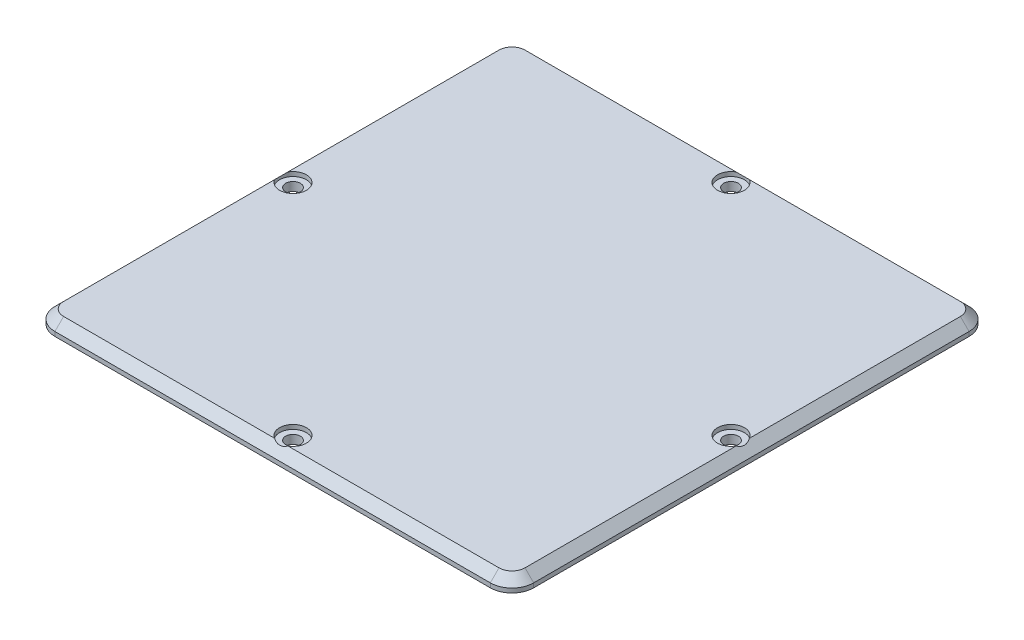
ISO-10303-21;
HEADER;
FILE_DESCRIPTION(('STEP AP214'),'2;1');
FILE_NAME('part.step','',(''),(''),'','','');
FILE_SCHEMA(('AUTOMOTIVE_DESIGN { 1 0 10303 214 1 1 1 1 }'));
ENDSEC;
DATA;
#1=APPLICATION_CONTEXT('core data for automotive mechanical design processes');
#2=APPLICATION_PROTOCOL_DEFINITION('international standard','automotive_design',2000,#1);
#3=PRODUCT_CONTEXT('',#1,'mechanical');
#4=PRODUCT('Part','Part','',(#3));
#5=PRODUCT_RELATED_PRODUCT_CATEGORY('part','',(#4));
#6=PRODUCT_DEFINITION_FORMATION('','',#4);
#7=PRODUCT_DEFINITION_CONTEXT('part definition',#1,'design');
#8=PRODUCT_DEFINITION('design','',#6,#7);
#9=PRODUCT_DEFINITION_SHAPE('','',#8);
#10=(LENGTH_UNIT() NAMED_UNIT(*) SI_UNIT(.MILLI.,.METRE.));
#11=(NAMED_UNIT(*) PLANE_ANGLE_UNIT() SI_UNIT($,.RADIAN.));
#12=(NAMED_UNIT(*) SI_UNIT($,.STERADIAN.) SOLID_ANGLE_UNIT());
#13=UNCERTAINTY_MEASURE_WITH_UNIT(LENGTH_MEASURE(1.E-05),#10,'distance_accuracy_value','');
#14=(GEOMETRIC_REPRESENTATION_CONTEXT(3) GLOBAL_UNCERTAINTY_ASSIGNED_CONTEXT((#13)) GLOBAL_UNIT_ASSIGNED_CONTEXT((#10,
#11,#12)) REPRESENTATION_CONTEXT('',''));
#15=CARTESIAN_POINT('',(0.,0.,0.));
#16=DIRECTION('',(0.,0.,1.));
#17=DIRECTION('',(1.,0.,0.));
#18=AXIS2_PLACEMENT_3D('',#15,#16,#17);
#19=CARTESIAN_POINT('',(36.75,-11.,-84.2641621588115));
#20=DIRECTION('',(0.,1.,0.));
#21=DIRECTION('',(0.,0.,1.));
#22=AXIS2_PLACEMENT_3D('',#19,#20,#21);
#23=CYLINDRICAL_SURFACE('',#22,5.);
#24=CARTESIAN_POINT('',(36.75,0.,-84.2641621588115));
#25=DIRECTION('',(0.,-1.,0.));
#26=DIRECTION('',(0.,0.,-1.));
#27=AXIS2_PLACEMENT_3D('',#24,#25,#26);
#28=CIRCLE('',#27,5.);
#29=CARTESIAN_POINT('',(36.75,0.,-89.2641621588116));
#30=VERTEX_POINT('',#29);
#31=EDGE_CURVE('E157',#30,#30,#28,.T.);
#32=ORIENTED_EDGE('',*,*,#31,.T.);
#33=EDGE_LOOP('',(#32));
#34=FACE_BOUND('',#33,.T.);
#35=CARTESIAN_POINT('',(36.75,-10.5652173913043,-84.2641621588115));
#36=DIRECTION('',(0.,-0.996240588195683,0.086629616364842));
#37=DIRECTION('',(0.,0.086629616364842,0.996240588195683));
#38=AXIS2_PLACEMENT_3D('',#35,#36,#37);
#39=ELLIPSE('',#38,5.01886799157182,5.);
#40=CARTESIAN_POINT('',(36.75,-10.1304347826087,-79.2641621588115));
#41=VERTEX_POINT('',#40);
#42=EDGE_CURVE('E394',#41,#41,#39,.T.);
#43=ORIENTED_EDGE('',*,*,#42,.F.);
#44=EDGE_LOOP('',(#43));
#45=FACE_BOUND('',#44,.T.);
#46=ADVANCED_FACE('F35',(#34,#45),#23,.T.);
#47=CARTESIAN_POINT('',(36.75,-11.,-36.7641621588116));
#48=DIRECTION('',(0.,1.,0.));
#49=DIRECTION('',(0.,0.,1.));
#50=AXIS2_PLACEMENT_3D('',#47,#48,#49);
#51=CYLINDRICAL_SURFACE('',#50,5.);
#52=CARTESIAN_POINT('',(36.75,0.,-36.7641621588116));
#53=DIRECTION('',(0.,-1.,0.));
#54=DIRECTION('',(0.,0.,-1.));
#55=AXIS2_PLACEMENT_3D('',#52,#53,#54);
#56=CIRCLE('',#55,5.);
#57=CARTESIAN_POINT('',(36.75,0.,-41.7641621588116));
#58=VERTEX_POINT('',#57);
#59=EDGE_CURVE('E385',#58,#58,#56,.T.);
#60=ORIENTED_EDGE('',*,*,#59,.T.);
#61=EDGE_LOOP('',(#60));
#62=FACE_BOUND('',#61,.T.);
#63=CARTESIAN_POINT('',(36.75,-6.43478260869565,-36.7641621588116));
#64=DIRECTION('',(0.,-0.996240588195683,0.086629616364842));
#65=DIRECTION('',(0.,0.086629616364842,0.996240588195683));
#66=AXIS2_PLACEMENT_3D('',#63,#64,#65);
#67=ELLIPSE('',#66,5.01886799157182,5.);
#68=CARTESIAN_POINT('',(36.75,-6.,-31.7641621588116));
#69=VERTEX_POINT('',#68);
#70=EDGE_CURVE('E397',#69,#69,#67,.T.);
#71=ORIENTED_EDGE('',*,*,#70,.F.);
#72=EDGE_LOOP('',(#71));
#73=FACE_BOUND('',#72,.T.);
#74=ADVANCED_FACE('F350',(#62,#73),#51,.T.);
#75=CARTESIAN_POINT('',(84.25,-11.,-36.7641621588116));
#76=DIRECTION('',(0.,1.,0.));
#77=DIRECTION('',(0.,0.,1.));
#78=AXIS2_PLACEMENT_3D('',#75,#76,#77);
#79=CYLINDRICAL_SURFACE('',#78,5.00000000000001);
#80=CARTESIAN_POINT('',(84.25,0.,-36.7641621588116));
#81=DIRECTION('',(0.,-1.,0.));
#82=DIRECTION('',(0.,0.,-1.));
#83=AXIS2_PLACEMENT_3D('',#80,#81,#82);
#84=CIRCLE('',#83,5.00000000000001);
#85=CARTESIAN_POINT('',(84.25,0.,-41.7641621588116));
#86=VERTEX_POINT('',#85);
#87=EDGE_CURVE('E388',#86,#86,#84,.T.);
#88=ORIENTED_EDGE('',*,*,#87,.T.);
#89=EDGE_LOOP('',(#88));
#90=FACE_BOUND('',#89,.T.);
#91=CARTESIAN_POINT('',(84.25,-6.43478260869565,-36.7641621588116));
#92=DIRECTION('',(0.,-0.996240588195683,0.086629616364842));
#93=DIRECTION('',(0.,0.086629616364842,0.996240588195683));
#94=AXIS2_PLACEMENT_3D('',#91,#92,#93);
#95=ELLIPSE('',#94,5.01886799157183,5.00000000000001);
#96=CARTESIAN_POINT('',(84.25,-6.,-31.7641621588115));
#97=VERTEX_POINT('',#96);
#98=EDGE_CURVE('E400',#97,#97,#95,.T.);
#99=ORIENTED_EDGE('',*,*,#98,.F.);
#100=EDGE_LOOP('',(#99));
#101=FACE_BOUND('',#100,.T.);
#102=ADVANCED_FACE('F356',(#90,#101),#79,.T.);
#103=CARTESIAN_POINT('',(84.25,-11.,-84.2641621588115));
#104=DIRECTION('',(0.,1.,0.));
#105=DIRECTION('',(0.,0.,1.));
#106=AXIS2_PLACEMENT_3D('',#103,#104,#105);
#107=CYLINDRICAL_SURFACE('',#106,5.00000000000001);
#108=CARTESIAN_POINT('',(84.25,0.,-84.2641621588115));
#109=DIRECTION('',(0.,-1.,0.));
#110=DIRECTION('',(0.,0.,-1.));
#111=AXIS2_PLACEMENT_3D('',#108,#109,#110);
#112=CIRCLE('',#111,5.00000000000001);
#113=CARTESIAN_POINT('',(84.25,0.,-89.2641621588116));
#114=VERTEX_POINT('',#113);
#115=EDGE_CURVE('E391',#114,#114,#112,.T.);
#116=ORIENTED_EDGE('',*,*,#115,.T.);
#117=EDGE_LOOP('',(#116));
#118=FACE_BOUND('',#117,.T.);
#119=CARTESIAN_POINT('',(84.25,-10.5652173913043,-84.2641621588115));
#120=DIRECTION('',(0.,-0.996240588195683,0.086629616364842));
#121=DIRECTION('',(0.,0.086629616364842,0.996240588195683));
#122=AXIS2_PLACEMENT_3D('',#119,#120,#121);
#123=ELLIPSE('',#122,5.01886799157183,5.00000000000001);
#124=CARTESIAN_POINT('',(84.25,-10.1304347826087,-79.2641621588115));
#125=VERTEX_POINT('',#124);
#126=EDGE_CURVE('E403',#125,#125,#123,.T.);
#127=ORIENTED_EDGE('',*,*,#126,.F.);
#128=EDGE_LOOP('',(#127));
#129=FACE_BOUND('',#128,.T.);
#130=ADVANCED_FACE('F462',(#118,#129),#107,.T.);
#131=CARTESIAN_POINT('',(10.3,3.,-115.7));
#132=DIRECTION('',(0.,0.,-1.));
#133=DIRECTION('',(-1.,0.,0.));
#134=AXIS2_PLACEMENT_3D('',#131,#132,#133);
#135=PLANE('',#134);
#136=DIRECTION('',(0.,-1.,0.));
#137=VECTOR('',#136,1.);
#138=CARTESIAN_POINT('',(10.3,3.,-115.7));
#139=LINE('',#138,#137);
#140=CARTESIAN_POINT('',(10.3,0.999999999999971,-115.7));
#141=VERTEX_POINT('',#140);
#142=CARTESIAN_POINT('',(10.3,0.,-115.7));
#143=VERTEX_POINT('',#142);
#144=EDGE_CURVE('E163',#141,#143,#139,.T.);
#145=ORIENTED_EDGE('',*,*,#144,.F.);
#146=DIRECTION('',(1.,0.,0.));
#147=VECTOR('',#146,1.);
#148=CARTESIAN_POINT('',(110.7,0.999999999999971,-115.7));
#149=LINE('',#148,#147);
#150=CARTESIAN_POINT('',(110.7,0.999999999999971,-115.7));
#151=VERTEX_POINT('',#150);
#152=EDGE_CURVE('E206',#141,#151,#149,.T.);
#153=ORIENTED_EDGE('',*,*,#152,.T.);
#154=DIRECTION('',(0.,-1.,0.));
#155=VECTOR('',#154,1.);
#156=CARTESIAN_POINT('',(110.7,3.,-115.7));
#157=LINE('',#156,#155);
#158=CARTESIAN_POINT('',(110.7,0.,-115.7));
#159=VERTEX_POINT('',#158);
#160=EDGE_CURVE('E170',#151,#159,#157,.T.);
#161=ORIENTED_EDGE('',*,*,#160,.T.);
#162=DIRECTION('',(1.,0.,0.));
#163=VECTOR('',#162,1.);
#164=CARTESIAN_POINT('',(10.3,0.,-115.7));
#165=LINE('',#164,#163);
#166=EDGE_CURVE('E231',#143,#159,#165,.T.);
#167=ORIENTED_EDGE('',*,*,#166,.F.);
#168=EDGE_LOOP('',(#145,#153,#161,#167));
#169=FACE_BOUND('',#168,.T.);
#170=ADVANCED_FACE('F310',(#169),#135,.T.);
#171=CARTESIAN_POINT('',(10.3,3.,-110.7));
#172=DIRECTION('',(0.,-1.,0.));
#173=DIRECTION('',(0.,0.,-1.));
#174=AXIS2_PLACEMENT_3D('',#171,#172,#173);
#175=CYLINDRICAL_SURFACE('',#174,5.);
#176=DIRECTION('',(0.,-1.,0.));
#177=VECTOR('',#176,1.);
#178=CARTESIAN_POINT('',(5.3,3.,-110.7));
#179=LINE('',#178,#177);
#180=CARTESIAN_POINT('',(5.3,0.999999999999971,-110.7));
#181=VERTEX_POINT('',#180);
#182=CARTESIAN_POINT('',(5.3,0.,-110.7));
#183=VERTEX_POINT('',#182);
#184=EDGE_CURVE('E166',#181,#183,#179,.T.);
#185=ORIENTED_EDGE('',*,*,#184,.F.);
#186=CARTESIAN_POINT('',(10.3,0.999999999999971,-110.7));
#187=DIRECTION('',(0.,-1.,0.));
#188=DIRECTION('',(0.,0.,-1.));
#189=AXIS2_PLACEMENT_3D('',#186,#187,#188);
#190=CIRCLE('',#189,5.);
#191=EDGE_CURVE('E202',#181,#141,#190,.T.);
#192=ORIENTED_EDGE('',*,*,#191,.T.);
#193=ORIENTED_EDGE('',*,*,#144,.T.);
#194=CARTESIAN_POINT('',(10.3,0.,-110.7));
#195=DIRECTION('',(0.,-1.,0.));
#196=DIRECTION('',(0.,0.,-1.));
#197=AXIS2_PLACEMENT_3D('',#194,#195,#196);
#198=CIRCLE('',#197,5.);
#199=EDGE_CURVE('E291',#183,#143,#198,.T.);
#200=ORIENTED_EDGE('',*,*,#199,.F.);
#201=EDGE_LOOP('',(#185,#192,#193,#200));
#202=FACE_BOUND('',#201,.T.);
#203=ADVANCED_FACE('F320',(#202),#175,.T.);
#204=CARTESIAN_POINT('',(5.3,3.,-10.3));
#205=DIRECTION('',(-1.,0.,0.));
#206=DIRECTION('',(0.,0.,1.));
#207=AXIS2_PLACEMENT_3D('',#204,#205,#206);
#208=PLANE('',#207);
#209=DIRECTION('',(0.,-1.,0.));
#210=VECTOR('',#209,1.);
#211=CARTESIAN_POINT('',(5.3,3.,-10.3));
#212=LINE('',#211,#210);
#213=CARTESIAN_POINT('',(5.3,0.999999999999971,-10.3));
#214=VERTEX_POINT('',#213);
#215=CARTESIAN_POINT('',(5.3,0.,-10.3));
#216=VERTEX_POINT('',#215);
#217=EDGE_CURVE('E295',#214,#216,#212,.T.);
#218=ORIENTED_EDGE('',*,*,#217,.F.);
#219=DIRECTION('',(0.,0.,-1.));
#220=VECTOR('',#219,1.);
#221=CARTESIAN_POINT('',(5.3,0.999999999999971,-110.7));
#222=LINE('',#221,#220);
#223=EDGE_CURVE('E196',#214,#181,#222,.T.);
#224=ORIENTED_EDGE('',*,*,#223,.T.);
#225=ORIENTED_EDGE('',*,*,#184,.T.);
#226=DIRECTION('',(0.,0.,-1.));
#227=VECTOR('',#226,1.);
#228=CARTESIAN_POINT('',(5.3,0.,-10.3));
#229=LINE('',#228,#227);
#230=EDGE_CURVE('E288',#216,#183,#229,.T.);
#231=ORIENTED_EDGE('',*,*,#230,.F.);
#232=EDGE_LOOP('',(#218,#224,#225,#231));
#233=FACE_BOUND('',#232,.T.);
#234=ADVANCED_FACE('F518',(#233),#208,.T.);
#235=CARTESIAN_POINT('',(10.3,3.,-10.3));
#236=DIRECTION('',(0.,-1.,0.));
#237=DIRECTION('',(0.,0.,-1.));
#238=AXIS2_PLACEMENT_3D('',#235,#236,#237);
#239=CYLINDRICAL_SURFACE('',#238,5.);
#240=DIRECTION('',(0.,-1.,0.));
#241=VECTOR('',#240,1.);
#242=CARTESIAN_POINT('',(10.3,3.,-5.3));
#243=LINE('',#242,#241);
#244=CARTESIAN_POINT('',(10.3,0.999999999999971,-5.3));
#245=VERTEX_POINT('',#244);
#246=CARTESIAN_POINT('',(10.3,0.,-5.3));
#247=VERTEX_POINT('',#246);
#248=EDGE_CURVE('E297',#245,#247,#243,.T.);
#249=ORIENTED_EDGE('',*,*,#248,.F.);
#250=CARTESIAN_POINT('',(10.3,0.999999999999971,-10.3));
#251=DIRECTION('',(0.,-1.,0.));
#252=DIRECTION('',(0.,0.,-1.));
#253=AXIS2_PLACEMENT_3D('',#250,#251,#252);
#254=CIRCLE('',#253,5.);
#255=EDGE_CURVE('E198',#245,#214,#254,.T.);
#256=ORIENTED_EDGE('',*,*,#255,.T.);
#257=ORIENTED_EDGE('',*,*,#217,.T.);
#258=CARTESIAN_POINT('',(10.3,0.,-10.3));
#259=DIRECTION('',(0.,-1.,0.));
#260=DIRECTION('',(0.,0.,-1.));
#261=AXIS2_PLACEMENT_3D('',#258,#259,#260);
#262=CIRCLE('',#261,5.);
#263=EDGE_CURVE('E285',#247,#216,#262,.T.);
#264=ORIENTED_EDGE('',*,*,#263,.F.);
#265=EDGE_LOOP('',(#249,#256,#257,#264));
#266=FACE_BOUND('',#265,.T.);
#267=ADVANCED_FACE('F521',(#266),#239,.T.);
#268=CARTESIAN_POINT('',(10.3,3.,-5.3));
#269=DIRECTION('',(0.,0.,-1.));
#270=DIRECTION('',(-1.,0.,0.));
#271=AXIS2_PLACEMENT_3D('',#268,#269,#270);
#272=PLANE('',#271);
#273=DIRECTION('',(0.,-1.,0.));
#274=VECTOR('',#273,1.);
#275=CARTESIAN_POINT('',(110.7,3.,-5.3));
#276=LINE('',#275,#274);
#277=CARTESIAN_POINT('',(110.7,0.99999999999997,-5.3));
#278=VERTEX_POINT('',#277);
#279=CARTESIAN_POINT('',(110.7,0.,-5.3));
#280=VERTEX_POINT('',#279);
#281=EDGE_CURVE('E299',#278,#280,#276,.T.);
#282=ORIENTED_EDGE('',*,*,#281,.F.);
#283=DIRECTION('',(-1.,0.,0.));
#284=VECTOR('',#283,1.);
#285=CARTESIAN_POINT('',(10.3,0.999999999999957,-5.3));
#286=LINE('',#285,#284);
#287=EDGE_CURVE('E191',#278,#245,#286,.T.);
#288=ORIENTED_EDGE('',*,*,#287,.T.);
#289=ORIENTED_EDGE('',*,*,#248,.T.);
#290=DIRECTION('',(1.,0.,0.));
#291=VECTOR('',#290,1.);
#292=CARTESIAN_POINT('',(10.3,0.,-5.3));
#293=LINE('',#292,#291);
#294=EDGE_CURVE('E282',#247,#280,#293,.T.);
#295=ORIENTED_EDGE('',*,*,#294,.T.);
#296=EDGE_LOOP('',(#282,#288,#289,#295));
#297=FACE_BOUND('',#296,.T.);
#298=ADVANCED_FACE('F525',(#297),#272,.F.);
#299=CARTESIAN_POINT('',(110.7,3.,-10.3));
#300=DIRECTION('',(0.,-1.,0.));
#301=DIRECTION('',(0.,0.,-1.));
#302=AXIS2_PLACEMENT_3D('',#299,#300,#301);
#303=CYLINDRICAL_SURFACE('',#302,5.);
#304=DIRECTION('',(0.,-1.,0.));
#305=VECTOR('',#304,1.);
#306=CARTESIAN_POINT('',(115.7,3.,-10.3));
#307=LINE('',#306,#305);
#308=CARTESIAN_POINT('',(115.7,0.99999999999997,-10.3));
#309=VERTEX_POINT('',#308);
#310=CARTESIAN_POINT('',(115.7,0.,-10.3));
#311=VERTEX_POINT('',#310);
#312=EDGE_CURVE('E301',#309,#311,#307,.T.);
#313=ORIENTED_EDGE('',*,*,#312,.F.);
#314=CARTESIAN_POINT('',(110.7,0.99999999999997,-10.3));
#315=DIRECTION('',(0.,-1.,0.));
#316=DIRECTION('',(0.,0.,-1.));
#317=AXIS2_PLACEMENT_3D('',#314,#315,#316);
#318=CIRCLE('',#317,5.);
#319=EDGE_CURVE('E200',#309,#278,#318,.T.);
#320=ORIENTED_EDGE('',*,*,#319,.T.);
#321=ORIENTED_EDGE('',*,*,#281,.T.);
#322=CARTESIAN_POINT('',(110.7,0.,-10.3));
#323=DIRECTION('',(0.,1.,0.));
#324=DIRECTION('',(0.,0.,1.));
#325=AXIS2_PLACEMENT_3D('',#322,#323,#324);
#326=CIRCLE('',#325,5.);
#327=EDGE_CURVE('E279',#280,#311,#326,.T.);
#328=ORIENTED_EDGE('',*,*,#327,.T.);
#329=EDGE_LOOP('',(#313,#320,#321,#328));
#330=FACE_BOUND('',#329,.T.);
#331=ADVANCED_FACE('F529',(#330),#303,.T.);
#332=CARTESIAN_POINT('',(115.7,3.,-10.3));
#333=DIRECTION('',(-1.,0.,0.));
#334=DIRECTION('',(0.,0.,1.));
#335=AXIS2_PLACEMENT_3D('',#332,#333,#334);
#336=PLANE('',#335);
#337=DIRECTION('',(0.,-1.,0.));
#338=VECTOR('',#337,1.);
#339=CARTESIAN_POINT('',(115.7,3.,-110.7));
#340=LINE('',#339,#338);
#341=CARTESIAN_POINT('',(115.7,0.999999999999971,-110.7));
#342=VERTEX_POINT('',#341);
#343=CARTESIAN_POINT('',(115.7,0.,-110.7));
#344=VERTEX_POINT('',#343);
#345=EDGE_CURVE('E302',#342,#344,#340,.T.);
#346=ORIENTED_EDGE('',*,*,#345,.F.);
#347=DIRECTION('',(0.,0.,1.));
#348=VECTOR('',#347,1.);
#349=CARTESIAN_POINT('',(115.7,0.999999999999998,-10.3));
#350=LINE('',#349,#348);
#351=EDGE_CURVE('E194',#342,#309,#350,.T.);
#352=ORIENTED_EDGE('',*,*,#351,.T.);
#353=ORIENTED_EDGE('',*,*,#312,.T.);
#354=DIRECTION('',(0.,0.,-1.));
#355=VECTOR('',#354,1.);
#356=CARTESIAN_POINT('',(115.7,0.,-10.3));
#357=LINE('',#356,#355);
#358=EDGE_CURVE('E276',#311,#344,#357,.T.);
#359=ORIENTED_EDGE('',*,*,#358,.T.);
#360=EDGE_LOOP('',(#346,#352,#353,#359));
#361=FACE_BOUND('',#360,.T.);
#362=ADVANCED_FACE('F533',(#361),#336,.F.);
#363=CARTESIAN_POINT('',(110.7,3.,-110.7));
#364=DIRECTION('',(0.,-1.,0.));
#365=DIRECTION('',(0.,0.,-1.));
#366=AXIS2_PLACEMENT_3D('',#363,#364,#365);
#367=CYLINDRICAL_SURFACE('',#366,5.00000000000001);
#368=ORIENTED_EDGE('',*,*,#160,.F.);
#369=CARTESIAN_POINT('',(110.7,0.999999999999971,-110.7));
#370=DIRECTION('',(0.,-1.,0.));
#371=DIRECTION('',(0.,0.,-1.));
#372=AXIS2_PLACEMENT_3D('',#369,#370,#371);
#373=CIRCLE('',#372,5.00000000000001);
#374=EDGE_CURVE('E204',#151,#342,#373,.T.);
#375=ORIENTED_EDGE('',*,*,#374,.T.);
#376=ORIENTED_EDGE('',*,*,#345,.T.);
#377=CARTESIAN_POINT('',(110.7,0.,-110.7));
#378=DIRECTION('',(0.,-1.,0.));
#379=DIRECTION('',(0.,0.,-1.));
#380=AXIS2_PLACEMENT_3D('',#377,#378,#379);
#381=CIRCLE('',#380,5.00000000000001);
#382=EDGE_CURVE('E273',#159,#344,#381,.T.);
#383=ORIENTED_EDGE('',*,*,#382,.F.);
#384=EDGE_LOOP('',(#368,#375,#376,#383));
#385=FACE_BOUND('',#384,.T.);
#386=ADVANCED_FACE('F312',(#385),#367,.T.);
#387=CARTESIAN_POINT('',(110.7,3.,-110.7));
#388=DIRECTION('',(0.,-1.,0.));
#389=DIRECTION('',(0.,0.,-1.));
#390=AXIS2_PLACEMENT_3D('',#387,#388,#389);
#391=PLANE('',#390);
#392=DIRECTION('',(-1.,0.,0.));
#393=VECTOR('',#392,1.);
#394=CARTESIAN_POINT('',(10.3,3.,-113.7));
#395=LINE('',#394,#393);
#396=CARTESIAN_POINT('',(110.7,3.,-113.7));
#397=VERTEX_POINT('',#396);
#398=CARTESIAN_POINT('',(62.0231546211728,3.,-113.7));
#399=VERTEX_POINT('',#398);
#400=EDGE_CURVE('E155',#397,#399,#395,.T.);
#401=ORIENTED_EDGE('',*,*,#400,.T.);
#402=CARTESIAN_POINT('',(60.5,3.,-111.));
#403=DIRECTION('',(0.,1.,0.));
#404=DIRECTION('',(0.,0.,1.));
#405=AXIS2_PLACEMENT_3D('',#402,#403,#404);
#406=CIRCLE('',#405,3.1);
#407=CARTESIAN_POINT('',(58.9768453788271,3.,-113.7));
#408=VERTEX_POINT('',#407);
#409=EDGE_CURVE('E49',#408,#399,#406,.T.);
#410=ORIENTED_EDGE('',*,*,#409,.F.);
#411=CARTESIAN_POINT('',(10.3,3.,-113.7));
#412=VERTEX_POINT('',#411);
#413=EDGE_CURVE('E153',#408,#412,#395,.T.);
#414=ORIENTED_EDGE('',*,*,#413,.T.);
#415=CARTESIAN_POINT('',(10.3,3.,-110.7));
#416=DIRECTION('',(0.,-1.,0.));
#417=DIRECTION('',(0.,0.,-1.));
#418=AXIS2_PLACEMENT_3D('',#415,#416,#417);
#419=CIRCLE('',#418,2.99999999999996);
#420=CARTESIAN_POINT('',(7.30000000000004,3.,-110.7));
#421=VERTEX_POINT('',#420);
#422=EDGE_CURVE('E173',#412,#421,#419,.F.);
#423=ORIENTED_EDGE('',*,*,#422,.T.);
#424=DIRECTION('',(0.,0.,1.));
#425=VECTOR('',#424,1.);
#426=CARTESIAN_POINT('',(7.30000000000004,3.,-10.3));
#427=LINE('',#426,#425);
#428=CARTESIAN_POINT('',(7.30000000000004,3.,-62.0231546211729));
#429=VERTEX_POINT('',#428);
#430=EDGE_CURVE('E176',#421,#429,#427,.T.);
#431=ORIENTED_EDGE('',*,*,#430,.T.);
#432=CARTESIAN_POINT('',(9.99999999999999,3.,-60.5));
#433=DIRECTION('',(0.,1.,0.));
#434=DIRECTION('',(0.,0.,1.));
#435=AXIS2_PLACEMENT_3D('',#432,#433,#434);
#436=CIRCLE('',#435,3.1);
#437=CARTESIAN_POINT('',(7.30000000000004,3.,-58.9768453788271));
#438=VERTEX_POINT('',#437);
#439=EDGE_CURVE('E56',#438,#429,#436,.T.);
#440=ORIENTED_EDGE('',*,*,#439,.F.);
#441=CARTESIAN_POINT('',(7.30000000000004,3.,-10.3));
#442=VERTEX_POINT('',#441);
#443=EDGE_CURVE('E175',#438,#442,#427,.T.);
#444=ORIENTED_EDGE('',*,*,#443,.T.);
#445=CARTESIAN_POINT('',(10.3,3.,-10.3));
#446=DIRECTION('',(0.,-1.,0.));
#447=DIRECTION('',(0.,0.,-1.));
#448=AXIS2_PLACEMENT_3D('',#445,#446,#447);
#449=CIRCLE('',#448,2.99999999999996);
#450=CARTESIAN_POINT('',(10.3,3.,-7.30000000000004));
#451=VERTEX_POINT('',#450);
#452=EDGE_CURVE('E185',#442,#451,#449,.F.);
#453=ORIENTED_EDGE('',*,*,#452,.T.);
#454=DIRECTION('',(1.,0.,0.));
#455=VECTOR('',#454,1.);
#456=CARTESIAN_POINT('',(110.7,3.,-7.30000000000003));
#457=LINE('',#456,#455);
#458=CARTESIAN_POINT('',(58.9768453788272,3.,-7.30000000000003));
#459=VERTEX_POINT('',#458);
#460=EDGE_CURVE('E188',#451,#459,#457,.T.);
#461=ORIENTED_EDGE('',*,*,#460,.T.);
#462=CARTESIAN_POINT('',(60.5,3.,-10.));
#463=DIRECTION('',(0.,1.,0.));
#464=DIRECTION('',(0.,0.,1.));
#465=AXIS2_PLACEMENT_3D('',#462,#463,#464);
#466=CIRCLE('',#465,3.10000000000001);
#467=CARTESIAN_POINT('',(62.0231546211728,3.,-7.30000000000003));
#468=VERTEX_POINT('',#467);
#469=EDGE_CURVE('E246',#468,#459,#466,.T.);
#470=ORIENTED_EDGE('',*,*,#469,.F.);
#471=CARTESIAN_POINT('',(110.7,3.,-7.30000000000004));
#472=VERTEX_POINT('',#471);
#473=EDGE_CURVE('E187',#468,#472,#457,.T.);
#474=ORIENTED_EDGE('',*,*,#473,.T.);
#475=CARTESIAN_POINT('',(110.7,3.,-10.3));
#476=DIRECTION('',(0.,-1.,0.));
#477=DIRECTION('',(0.,0.,-1.));
#478=AXIS2_PLACEMENT_3D('',#475,#476,#477);
#479=CIRCLE('',#478,2.99999999999996);
#480=CARTESIAN_POINT('',(113.7,3.,-10.3));
#481=VERTEX_POINT('',#480);
#482=EDGE_CURVE('E183',#472,#481,#479,.F.);
#483=ORIENTED_EDGE('',*,*,#482,.T.);
#484=DIRECTION('',(0.,0.,-1.));
#485=VECTOR('',#484,1.);
#486=CARTESIAN_POINT('',(113.7,3.,-110.7));
#487=LINE('',#486,#485);
#488=CARTESIAN_POINT('',(113.7,3.,-58.9768453788272));
#489=VERTEX_POINT('',#488);
#490=EDGE_CURVE('E180',#481,#489,#487,.T.);
#491=ORIENTED_EDGE('',*,*,#490,.T.);
#492=CARTESIAN_POINT('',(111.,3.,-60.5));
#493=DIRECTION('',(0.,1.,0.));
#494=DIRECTION('',(0.,0.,1.));
#495=AXIS2_PLACEMENT_3D('',#492,#493,#494);
#496=CIRCLE('',#495,3.10000000000001);
#497=CARTESIAN_POINT('',(113.7,3.,-62.0231546211728));
#498=VERTEX_POINT('',#497);
#499=EDGE_CURVE('E241',#498,#489,#496,.T.);
#500=ORIENTED_EDGE('',*,*,#499,.F.);
#501=CARTESIAN_POINT('',(113.7,3.,-110.7));
#502=VERTEX_POINT('',#501);
#503=EDGE_CURVE('E179',#498,#502,#487,.T.);
#504=ORIENTED_EDGE('',*,*,#503,.T.);
#505=CARTESIAN_POINT('',(110.7,3.,-110.7));
#506=DIRECTION('',(0.,-1.,0.));
#507=DIRECTION('',(0.,0.,-1.));
#508=AXIS2_PLACEMENT_3D('',#505,#506,#507);
#509=CIRCLE('',#508,2.99999999999998);
#510=EDGE_CURVE('E165',#502,#397,#509,.F.);
#511=ORIENTED_EDGE('',*,*,#510,.T.);
#512=EDGE_LOOP('',(#401,#410,#414,#423,#431,#440,#444,#453,#461,#470,#474,#483,#491,#500,#504,#511));
#513=FACE_BOUND('',#512,.T.);
#514=ADVANCED_FACE('F152',(#513),#391,.F.);
#515=CARTESIAN_POINT('',(110.7,0.,-110.7));
#516=DIRECTION('',(0.,-1.,0.));
#517=DIRECTION('',(0.,0.,-1.));
#518=AXIS2_PLACEMENT_3D('',#515,#516,#517);
#519=PLANE('',#518);
#520=ORIENTED_EDGE('',*,*,#115,.F.);
#521=EDGE_LOOP('',(#520));
#522=FACE_BOUND('',#521,.T.);
#523=ORIENTED_EDGE('',*,*,#87,.F.);
#524=EDGE_LOOP('',(#523));
#525=FACE_BOUND('',#524,.T.);
#526=ORIENTED_EDGE('',*,*,#59,.F.);
#527=EDGE_LOOP('',(#526));
#528=FACE_BOUND('',#527,.T.);
#529=ORIENTED_EDGE('',*,*,#31,.F.);
#530=EDGE_LOOP('',(#529));
#531=FACE_BOUND('',#530,.T.);
#532=CARTESIAN_POINT('',(60.5,0.,-111.));
#533=DIRECTION('',(0.,-1.,0.));
#534=DIRECTION('',(0.,0.,-1.));
#535=AXIS2_PLACEMENT_3D('',#532,#533,#534);
#536=CIRCLE('',#535,1.7);
#537=CARTESIAN_POINT('',(60.5,0.,-112.7));
#538=VERTEX_POINT('',#537);
#539=EDGE_CURVE('E39',#538,#538,#536,.T.);
#540=ORIENTED_EDGE('',*,*,#539,.F.);
#541=EDGE_LOOP('',(#540));
#542=FACE_BOUND('',#541,.T.);
#543=CARTESIAN_POINT('',(9.99999999999999,0.,-60.5));
#544=DIRECTION('',(0.,-1.,0.));
#545=DIRECTION('',(0.,0.,-1.));
#546=AXIS2_PLACEMENT_3D('',#543,#544,#545);
#547=CIRCLE('',#546,1.7);
#548=CARTESIAN_POINT('',(9.99999999999999,0.,-62.2));
#549=VERTEX_POINT('',#548);
#550=EDGE_CURVE('E244',#549,#549,#547,.T.);
#551=ORIENTED_EDGE('',*,*,#550,.F.);
#552=EDGE_LOOP('',(#551));
#553=FACE_BOUND('',#552,.T.);
#554=CARTESIAN_POINT('',(60.5,0.,-10.));
#555=DIRECTION('',(0.,-1.,0.));
#556=DIRECTION('',(0.,0.,-1.));
#557=AXIS2_PLACEMENT_3D('',#554,#555,#556);
#558=CIRCLE('',#557,1.7);
#559=CARTESIAN_POINT('',(60.5,0.,-11.7));
#560=VERTEX_POINT('',#559);
#561=EDGE_CURVE('E238',#560,#560,#558,.T.);
#562=ORIENTED_EDGE('',*,*,#561,.F.);
#563=EDGE_LOOP('',(#562));
#564=FACE_BOUND('',#563,.T.);
#565=CARTESIAN_POINT('',(111.,0.,-60.5));
#566=DIRECTION('',(0.,-1.,0.));
#567=DIRECTION('',(0.,0.,-1.));
#568=AXIS2_PLACEMENT_3D('',#565,#566,#567);
#569=CIRCLE('',#568,1.69999999999999);
#570=CARTESIAN_POINT('',(111.,0.,-62.2));
#571=VERTEX_POINT('',#570);
#572=EDGE_CURVE('E213',#571,#571,#569,.T.);
#573=ORIENTED_EDGE('',*,*,#572,.F.);
#574=EDGE_LOOP('',(#573));
#575=FACE_BOUND('',#574,.T.);
#576=ORIENTED_EDGE('',*,*,#166,.T.);
#577=ORIENTED_EDGE('',*,*,#382,.T.);
#578=ORIENTED_EDGE('',*,*,#358,.F.);
#579=ORIENTED_EDGE('',*,*,#327,.F.);
#580=ORIENTED_EDGE('',*,*,#294,.F.);
#581=ORIENTED_EDGE('',*,*,#263,.T.);
#582=ORIENTED_EDGE('',*,*,#230,.T.);
#583=ORIENTED_EDGE('',*,*,#199,.T.);
#584=EDGE_LOOP('',(#576,#577,#578,#579,#580,#581,#582,#583));
#585=FACE_BOUND('',#584,.T.);
#586=ADVANCED_FACE('F315',(#522,#525,#528,#531,#542,#553,#564,#575,#585),#519,.T.);
#587=CARTESIAN_POINT('',(10.3,0.999999999999971,-115.7));
#588=DIRECTION('',(0.,0.70710678118655,-0.707106781186545));
#589=DIRECTION('',(-1.,0.,0.));
#590=AXIS2_PLACEMENT_3D('',#587,#588,#589);
#591=PLANE('',#590);
#592=CARTESIAN_POINT('',(60.5,5.69999999999993,-111.));
#593=DIRECTION('',(0.,0.70710678118655,-0.707106781186545));
#594=DIRECTION('',(0.,0.707106781186545,0.70710678118655));
#595=AXIS2_PLACEMENT_3D('',#592,#593,#594);
#596=ELLIPSE('',#595,4.38406204335658,3.1);
#597=EDGE_CURVE('E11',#399,#408,#596,.T.);
#598=ORIENTED_EDGE('',*,*,#597,.F.);
#599=ORIENTED_EDGE('',*,*,#400,.F.);
#600=DIRECTION('',(0.,0.707106781186545,0.70710678118655));
#601=VECTOR('',#600,1.);
#602=CARTESIAN_POINT('',(110.7,0.999999999999971,-115.7));
#603=LINE('',#602,#601);
#604=EDGE_CURVE('E227',#151,#397,#603,.T.);
#605=ORIENTED_EDGE('',*,*,#604,.F.);
#606=ORIENTED_EDGE('',*,*,#152,.F.);
#607=DIRECTION('',(0.,-0.707106781186545,-0.70710678118655));
#608=VECTOR('',#607,1.);
#609=CARTESIAN_POINT('',(10.3,3.,-113.7));
#610=LINE('',#609,#608);
#611=EDGE_CURVE('E161',#412,#141,#610,.T.);
#612=ORIENTED_EDGE('',*,*,#611,.F.);
#613=ORIENTED_EDGE('',*,*,#413,.F.);
#614=EDGE_LOOP('',(#598,#599,#605,#606,#612,#613));
#615=FACE_BOUND('',#614,.T.);
#616=ADVANCED_FACE('F37',(#615),#591,.T.);
#617=CARTESIAN_POINT('',(10.3,0.999999999999971,-110.7));
#618=DIRECTION('',(0.,-1.,0.));
#619=DIRECTION('',(0.,0.,-1.));
#620=AXIS2_PLACEMENT_3D('',#617,#618,#619);
#621=CONICAL_SURFACE('',#620,5.,0.785398163397451);
#622=ORIENTED_EDGE('',*,*,#611,.T.);
#623=ORIENTED_EDGE('',*,*,#191,.F.);
#624=DIRECTION('',(-0.70710678118655,-0.707106781186545,0.));
#625=VECTOR('',#624,1.);
#626=CARTESIAN_POINT('',(7.30000000000004,3.,-110.7));
#627=LINE('',#626,#625);
#628=EDGE_CURVE('E224',#421,#181,#627,.T.);
#629=ORIENTED_EDGE('',*,*,#628,.F.);
#630=ORIENTED_EDGE('',*,*,#422,.F.);
#631=EDGE_LOOP('',(#622,#623,#629,#630));
#632=FACE_BOUND('',#631,.T.);
#633=ADVANCED_FACE('F324',(#632),#621,.T.);
#634=CARTESIAN_POINT('',(110.7,0.999999999999971,-110.7));
#635=DIRECTION('',(0.,-1.,0.));
#636=DIRECTION('',(0.,0.,-1.));
#637=AXIS2_PLACEMENT_3D('',#634,#635,#636);
#638=CONICAL_SURFACE('',#637,5.00000000000001,0.78539816339745);
#639=ORIENTED_EDGE('',*,*,#604,.T.);
#640=ORIENTED_EDGE('',*,*,#510,.F.);
#641=DIRECTION('',(-0.70710678118655,0.707106781186545,0.));
#642=VECTOR('',#641,1.);
#643=CARTESIAN_POINT('',(115.7,0.999999999999971,-110.7));
#644=LINE('',#643,#642);
#645=EDGE_CURVE('E221',#342,#502,#644,.T.);
#646=ORIENTED_EDGE('',*,*,#645,.F.);
#647=ORIENTED_EDGE('',*,*,#374,.F.);
#648=EDGE_LOOP('',(#639,#640,#646,#647));
#649=FACE_BOUND('',#648,.T.);
#650=ADVANCED_FACE('F557',(#649),#638,.T.);
#651=CARTESIAN_POINT('',(5.3,0.999999999999971,-10.3));
#652=DIRECTION('',(-0.707106781186545,0.70710678118655,0.));
#653=DIRECTION('',(0.,0.,1.));
#654=AXIS2_PLACEMENT_3D('',#651,#652,#653);
#655=PLANE('',#654);
#656=CARTESIAN_POINT('',(9.99999999999999,5.69999999999993,-60.5));
#657=DIRECTION('',(-0.707106781186545,0.70710678118655,0.));
#658=DIRECTION('',(0.70710678118655,0.707106781186545,0.));
#659=AXIS2_PLACEMENT_3D('',#656,#657,#658);
#660=ELLIPSE('',#659,4.38406204335658,3.1);
#661=EDGE_CURVE('E44',#429,#438,#660,.T.);
#662=ORIENTED_EDGE('',*,*,#661,.F.);
#663=ORIENTED_EDGE('',*,*,#430,.F.);
#664=ORIENTED_EDGE('',*,*,#628,.T.);
#665=ORIENTED_EDGE('',*,*,#223,.F.);
#666=DIRECTION('',(-0.70710678118655,-0.707106781186545,0.));
#667=VECTOR('',#666,1.);
#668=CARTESIAN_POINT('',(7.30000000000004,3.,-10.3));
#669=LINE('',#668,#667);
#670=EDGE_CURVE('E218',#442,#214,#669,.T.);
#671=ORIENTED_EDGE('',*,*,#670,.F.);
#672=ORIENTED_EDGE('',*,*,#443,.F.);
#673=EDGE_LOOP('',(#662,#663,#664,#665,#671,#672));
#674=FACE_BOUND('',#673,.T.);
#675=ADVANCED_FACE('F329',(#674),#655,.T.);
#676=CARTESIAN_POINT('',(113.7,3.,-110.7));
#677=DIRECTION('',(-0.707106781186552,-0.707106781186543,0.));
#678=DIRECTION('',(0.,0.,-1.));
#679=AXIS2_PLACEMENT_3D('',#676,#677,#678);
#680=PLANE('',#679);
#681=CARTESIAN_POINT('',(111.,5.70000000000005,-60.5));
#682=DIRECTION('',(-0.707106781186552,-0.707106781186543,0.));
#683=DIRECTION('',(-0.707106781186543,0.707106781186552,0.));
#684=AXIS2_PLACEMENT_3D('',#681,#682,#683);
#685=ELLIPSE('',#684,4.38406204335663,3.10000000000001);
#686=EDGE_CURVE('E208',#489,#498,#685,.F.);
#687=ORIENTED_EDGE('',*,*,#686,.F.);
#688=ORIENTED_EDGE('',*,*,#490,.F.);
#689=DIRECTION('',(-0.707106781186543,0.707106781186552,0.));
#690=VECTOR('',#689,1.);
#691=CARTESIAN_POINT('',(115.7,0.999999999999998,-10.3));
#692=LINE('',#691,#690);
#693=EDGE_CURVE('E215',#309,#481,#692,.T.);
#694=ORIENTED_EDGE('',*,*,#693,.F.);
#695=ORIENTED_EDGE('',*,*,#351,.F.);
#696=ORIENTED_EDGE('',*,*,#645,.T.);
#697=ORIENTED_EDGE('',*,*,#503,.F.);
#698=EDGE_LOOP('',(#687,#688,#694,#695,#696,#697));
#699=FACE_BOUND('',#698,.T.);
#700=ADVANCED_FACE('F550',(#699),#680,.F.);
#701=CARTESIAN_POINT('',(10.3,0.999999999999971,-10.3));
#702=DIRECTION('',(0.,-1.,0.));
#703=DIRECTION('',(0.,0.,-1.));
#704=AXIS2_PLACEMENT_3D('',#701,#702,#703);
#705=CONICAL_SURFACE('',#704,5.,0.785398163397452);
#706=ORIENTED_EDGE('',*,*,#670,.T.);
#707=ORIENTED_EDGE('',*,*,#255,.F.);
#708=DIRECTION('',(0.,-0.707106781186545,0.70710678118655));
#709=VECTOR('',#708,1.);
#710=CARTESIAN_POINT('',(10.3,3.,-7.30000000000004));
#711=LINE('',#710,#709);
#712=EDGE_CURVE('E212',#451,#245,#711,.T.);
#713=ORIENTED_EDGE('',*,*,#712,.F.);
#714=ORIENTED_EDGE('',*,*,#452,.F.);
#715=EDGE_LOOP('',(#706,#707,#713,#714));
#716=FACE_BOUND('',#715,.T.);
#717=ADVANCED_FACE('F546',(#716),#705,.T.);
#718=CARTESIAN_POINT('',(110.7,3.,-10.3));
#719=DIRECTION('',(0.,-1.,0.));
#720=DIRECTION('',(0.,0.,-1.));
#721=AXIS2_PLACEMENT_3D('',#718,#719,#720);
#722=CONICAL_SURFACE('',#721,2.99999999999996,0.785398163397452);
#723=ORIENTED_EDGE('',*,*,#693,.T.);
#724=ORIENTED_EDGE('',*,*,#482,.F.);
#725=DIRECTION('',(0.,0.707106781186545,-0.70710678118655));
#726=VECTOR('',#725,1.);
#727=CARTESIAN_POINT('',(110.7,0.99999999999997,-5.3));
#728=LINE('',#727,#726);
#729=EDGE_CURVE('E209',#278,#472,#728,.T.);
#730=ORIENTED_EDGE('',*,*,#729,.F.);
#731=ORIENTED_EDGE('',*,*,#319,.F.);
#732=EDGE_LOOP('',(#723,#724,#730,#731));
#733=FACE_BOUND('',#732,.T.);
#734=ADVANCED_FACE('F542',(#733),#722,.T.);
#735=CARTESIAN_POINT('',(110.7,3.,-7.30000000000003));
#736=DIRECTION('',(0.,-0.707106781186545,-0.70710678118655));
#737=DIRECTION('',(1.,0.,0.));
#738=AXIS2_PLACEMENT_3D('',#735,#736,#737);
#739=PLANE('',#738);
#740=CARTESIAN_POINT('',(60.5,5.69999999999999,-10.));
#741=DIRECTION('',(0.,-0.707106781186545,-0.70710678118655));
#742=DIRECTION('',(0.,0.70710678118655,-0.707106781186545));
#743=AXIS2_PLACEMENT_3D('',#740,#741,#742);
#744=ELLIPSE('',#743,4.38406204335662,3.10000000000001);
#745=EDGE_CURVE('E233',#459,#468,#744,.F.);
#746=ORIENTED_EDGE('',*,*,#745,.F.);
#747=ORIENTED_EDGE('',*,*,#460,.F.);
#748=ORIENTED_EDGE('',*,*,#712,.T.);
#749=ORIENTED_EDGE('',*,*,#287,.F.);
#750=ORIENTED_EDGE('',*,*,#729,.T.);
#751=ORIENTED_EDGE('',*,*,#473,.F.);
#752=EDGE_LOOP('',(#746,#747,#748,#749,#750,#751));
#753=FACE_BOUND('',#752,.T.);
#754=ADVANCED_FACE('F492',(#753),#739,.F.);
#755=CARTESIAN_POINT('',(111.,3.,-60.5));
#756=DIRECTION('',(0.,1.,0.));
#757=DIRECTION('',(0.,0.,1.));
#758=AXIS2_PLACEMENT_3D('',#755,#756,#757);
#759=CYLINDRICAL_SURFACE('',#758,1.69999999999999);
#760=ORIENTED_EDGE('',*,*,#572,.T.);
#761=EDGE_LOOP('',(#760));
#762=FACE_BOUND('',#761,.T.);
#763=CARTESIAN_POINT('',(111.,2.,-60.5));
#764=DIRECTION('',(0.,1.,0.));
#765=DIRECTION('',(0.,0.,1.));
#766=AXIS2_PLACEMENT_3D('',#763,#764,#765);
#767=CIRCLE('',#766,1.69999999999999);
#768=CARTESIAN_POINT('',(111.,2.,-58.8));
#769=VERTEX_POINT('',#768);
#770=EDGE_CURVE('E236',#769,#769,#767,.T.);
#771=ORIENTED_EDGE('',*,*,#770,.T.);
#772=EDGE_LOOP('',(#771));
#773=FACE_BOUND('',#772,.T.);
#774=ADVANCED_FACE('F488',(#762,#773),#759,.F.);
#775=CARTESIAN_POINT('',(112.7,2.,-60.5));
#776=DIRECTION('',(0.,-1.,0.));
#777=DIRECTION('',(0.,0.,-1.));
#778=AXIS2_PLACEMENT_3D('',#775,#776,#777);
#779=PLANE('',#778);
#780=ORIENTED_EDGE('',*,*,#770,.F.);
#781=EDGE_LOOP('',(#780));
#782=FACE_BOUND('',#781,.T.);
#783=CARTESIAN_POINT('',(111.,2.,-60.5));
#784=DIRECTION('',(0.,1.,0.));
#785=DIRECTION('',(0.,0.,1.));
#786=AXIS2_PLACEMENT_3D('',#783,#784,#785);
#787=CIRCLE('',#786,3.10000000000001);
#788=CARTESIAN_POINT('',(111.,2.,-57.4));
#789=VERTEX_POINT('',#788);
#790=EDGE_CURVE('E266',#789,#789,#787,.T.);
#791=ORIENTED_EDGE('',*,*,#790,.T.);
#792=EDGE_LOOP('',(#791));
#793=FACE_BOUND('',#792,.T.);
#794=ADVANCED_FACE('F491',(#782,#793),#779,.F.);
#795=CARTESIAN_POINT('',(111.,3.,-60.5));
#796=DIRECTION('',(0.,1.,0.));
#797=DIRECTION('',(0.,0.,1.));
#798=AXIS2_PLACEMENT_3D('',#795,#796,#797);
#799=CYLINDRICAL_SURFACE('',#798,3.10000000000001);
#800=ORIENTED_EDGE('',*,*,#686,.T.);
#801=ORIENTED_EDGE('',*,*,#499,.T.);
#802=EDGE_LOOP('',(#800,#801));
#803=FACE_BOUND('',#802,.T.);
#804=ORIENTED_EDGE('',*,*,#790,.F.);
#805=EDGE_LOOP('',(#804));
#806=FACE_BOUND('',#805,.T.);
#807=ADVANCED_FACE('F498',(#803,#806),#799,.F.);
#808=CARTESIAN_POINT('',(60.5,3.,-10.));
#809=DIRECTION('',(0.,1.,0.));
#810=DIRECTION('',(0.,0.,1.));
#811=AXIS2_PLACEMENT_3D('',#808,#809,#810);
#812=CYLINDRICAL_SURFACE('',#811,1.7);
#813=ORIENTED_EDGE('',*,*,#561,.T.);
#814=EDGE_LOOP('',(#813));
#815=FACE_BOUND('',#814,.T.);
#816=CARTESIAN_POINT('',(60.5,2.,-10.));
#817=DIRECTION('',(0.,1.,0.));
#818=DIRECTION('',(0.,0.,1.));
#819=AXIS2_PLACEMENT_3D('',#816,#817,#818);
#820=CIRCLE('',#819,1.7);
#821=CARTESIAN_POINT('',(60.5,2.,-8.3));
#822=VERTEX_POINT('',#821);
#823=EDGE_CURVE('E242',#822,#822,#820,.T.);
#824=ORIENTED_EDGE('',*,*,#823,.T.);
#825=EDGE_LOOP('',(#824));
#826=FACE_BOUND('',#825,.T.);
#827=ADVANCED_FACE('F503',(#815,#826),#812,.F.);
#828=CARTESIAN_POINT('',(62.2,2.,-10.));
#829=DIRECTION('',(0.,-1.,0.));
#830=DIRECTION('',(0.,0.,-1.));
#831=AXIS2_PLACEMENT_3D('',#828,#829,#830);
#832=PLANE('',#831);
#833=ORIENTED_EDGE('',*,*,#823,.F.);
#834=EDGE_LOOP('',(#833));
#835=FACE_BOUND('',#834,.T.);
#836=CARTESIAN_POINT('',(60.5,2.,-10.));
#837=DIRECTION('',(0.,1.,0.));
#838=DIRECTION('',(0.,0.,1.));
#839=AXIS2_PLACEMENT_3D('',#836,#837,#838);
#840=CIRCLE('',#839,3.10000000000001);
#841=CARTESIAN_POINT('',(60.5,2.,-6.9));
#842=VERTEX_POINT('',#841);
#843=EDGE_CURVE('E250',#842,#842,#840,.T.);
#844=ORIENTED_EDGE('',*,*,#843,.T.);
#845=EDGE_LOOP('',(#844));
#846=FACE_BOUND('',#845,.T.);
#847=ADVANCED_FACE('F509',(#835,#846),#832,.F.);
#848=CARTESIAN_POINT('',(60.5,3.,-10.));
#849=DIRECTION('',(0.,1.,0.));
#850=DIRECTION('',(0.,0.,1.));
#851=AXIS2_PLACEMENT_3D('',#848,#849,#850);
#852=CYLINDRICAL_SURFACE('',#851,3.10000000000001);
#853=ORIENTED_EDGE('',*,*,#745,.T.);
#854=ORIENTED_EDGE('',*,*,#469,.T.);
#855=EDGE_LOOP('',(#853,#854));
#856=FACE_BOUND('',#855,.T.);
#857=ORIENTED_EDGE('',*,*,#843,.F.);
#858=EDGE_LOOP('',(#857));
#859=FACE_BOUND('',#858,.T.);
#860=ADVANCED_FACE('F347',(#856,#859),#852,.F.);
#861=CARTESIAN_POINT('',(9.99999999999999,3.,-60.5));
#862=DIRECTION('',(0.,1.,0.));
#863=DIRECTION('',(0.,0.,1.));
#864=AXIS2_PLACEMENT_3D('',#861,#862,#863);
#865=CYLINDRICAL_SURFACE('',#864,1.7);
#866=ORIENTED_EDGE('',*,*,#550,.T.);
#867=EDGE_LOOP('',(#866));
#868=FACE_BOUND('',#867,.T.);
#869=CARTESIAN_POINT('',(9.99999999999999,2.,-60.5));
#870=DIRECTION('',(0.,1.,0.));
#871=DIRECTION('',(0.,0.,1.));
#872=AXIS2_PLACEMENT_3D('',#869,#870,#871);
#873=CIRCLE('',#872,1.7);
#874=CARTESIAN_POINT('',(9.99999999999999,2.,-58.8));
#875=VERTEX_POINT('',#874);
#876=EDGE_CURVE('E247',#875,#875,#873,.T.);
#877=ORIENTED_EDGE('',*,*,#876,.T.);
#878=EDGE_LOOP('',(#877));
#879=FACE_BOUND('',#878,.T.);
#880=ADVANCED_FACE('F341',(#868,#879),#865,.F.);
#881=CARTESIAN_POINT('',(11.7,2.,-60.5));
#882=DIRECTION('',(0.,-1.,0.));
#883=DIRECTION('',(0.,0.,-1.));
#884=AXIS2_PLACEMENT_3D('',#881,#882,#883);
#885=PLANE('',#884);
#886=ORIENTED_EDGE('',*,*,#876,.F.);
#887=EDGE_LOOP('',(#886));
#888=FACE_BOUND('',#887,.T.);
#889=CARTESIAN_POINT('',(9.99999999999999,2.,-60.5));
#890=DIRECTION('',(0.,1.,0.));
#891=DIRECTION('',(0.,0.,1.));
#892=AXIS2_PLACEMENT_3D('',#889,#890,#891);
#893=CIRCLE('',#892,3.1);
#894=CARTESIAN_POINT('',(9.99999999999999,2.,-57.4));
#895=VERTEX_POINT('',#894);
#896=EDGE_CURVE('E253',#895,#895,#893,.T.);
#897=ORIENTED_EDGE('',*,*,#896,.T.);
#898=EDGE_LOOP('',(#897));
#899=FACE_BOUND('',#898,.T.);
#900=ADVANCED_FACE('F336',(#888,#899),#885,.F.);
#901=CARTESIAN_POINT('',(9.99999999999999,3.,-60.5));
#902=DIRECTION('',(0.,1.,0.));
#903=DIRECTION('',(0.,0.,1.));
#904=AXIS2_PLACEMENT_3D('',#901,#902,#903);
#905=CYLINDRICAL_SURFACE('',#904,3.1);
#906=ORIENTED_EDGE('',*,*,#661,.T.);
#907=ORIENTED_EDGE('',*,*,#439,.T.);
#908=EDGE_LOOP('',(#906,#907));
#909=FACE_BOUND('',#908,.T.);
#910=ORIENTED_EDGE('',*,*,#896,.F.);
#911=EDGE_LOOP('',(#910));
#912=FACE_BOUND('',#911,.T.);
#913=ADVANCED_FACE('F332',(#909,#912),#905,.F.);
#914=CARTESIAN_POINT('',(60.5,3.,-111.));
#915=DIRECTION('',(0.,1.,0.));
#916=DIRECTION('',(0.,0.,1.));
#917=AXIS2_PLACEMENT_3D('',#914,#915,#916);
#918=CYLINDRICAL_SURFACE('',#917,1.7);
#919=ORIENTED_EDGE('',*,*,#539,.T.);
#920=EDGE_LOOP('',(#919));
#921=FACE_BOUND('',#920,.T.);
#922=CARTESIAN_POINT('',(60.5,2.,-111.));
#923=DIRECTION('',(0.,1.,0.));
#924=DIRECTION('',(0.,0.,1.));
#925=AXIS2_PLACEMENT_3D('',#922,#923,#924);
#926=CIRCLE('',#925,1.7);
#927=CARTESIAN_POINT('',(60.5,2.,-109.3));
#928=VERTEX_POINT('',#927);
#929=EDGE_CURVE('E379',#928,#928,#926,.T.);
#930=ORIENTED_EDGE('',*,*,#929,.T.);
#931=EDGE_LOOP('',(#930));
#932=FACE_BOUND('',#931,.T.);
#933=ADVANCED_FACE('F335',(#921,#932),#918,.F.);
#934=CARTESIAN_POINT('',(62.2,2.,-111.));
#935=DIRECTION('',(0.,-1.,0.));
#936=DIRECTION('',(0.,0.,-1.));
#937=AXIS2_PLACEMENT_3D('',#934,#935,#936);
#938=PLANE('',#937);
#939=ORIENTED_EDGE('',*,*,#929,.F.);
#940=EDGE_LOOP('',(#939));
#941=FACE_BOUND('',#940,.T.);
#942=CARTESIAN_POINT('',(60.5,2.,-111.));
#943=DIRECTION('',(0.,1.,0.));
#944=DIRECTION('',(0.,0.,1.));
#945=AXIS2_PLACEMENT_3D('',#942,#943,#944);
#946=CIRCLE('',#945,3.1);
#947=CARTESIAN_POINT('',(60.5,2.,-107.9));
#948=VERTEX_POINT('',#947);
#949=EDGE_CURVE('E156',#948,#948,#946,.T.);
#950=ORIENTED_EDGE('',*,*,#949,.T.);
#951=EDGE_LOOP('',(#950));
#952=FACE_BOUND('',#951,.T.);
#953=ADVANCED_FACE('F366',(#941,#952),#938,.F.);
#954=CARTESIAN_POINT('',(60.5,3.,-111.));
#955=DIRECTION('',(0.,1.,0.));
#956=DIRECTION('',(0.,0.,1.));
#957=AXIS2_PLACEMENT_3D('',#954,#955,#956);
#958=CYLINDRICAL_SURFACE('',#957,3.1);
#959=ORIENTED_EDGE('',*,*,#597,.T.);
#960=ORIENTED_EDGE('',*,*,#409,.T.);
#961=EDGE_LOOP('',(#959,#960));
#962=FACE_BOUND('',#961,.T.);
#963=ORIENTED_EDGE('',*,*,#949,.F.);
#964=EDGE_LOOP('',(#963));
#965=FACE_BOUND('',#964,.T.);
#966=ADVANCED_FACE('F145',(#962,#965),#958,.F.);
#967=CARTESIAN_POINT('',(173.416981903076,-6.,-31.7641621588116));
#968=DIRECTION('',(0.,-0.996240588195683,0.086629616364842));
#969=DIRECTION('',(0.,-0.086629616364842,-0.996240588195683));
#970=AXIS2_PLACEMENT_3D('',#967,#968,#969);
#971=PLANE('',#970);
#972=CARTESIAN_POINT('',(84.25,-10.5652173913044,-84.2641621588116));
#973=DIRECTION('',(0.,-0.996240588195683,0.086629616364842));
#974=DIRECTION('',(0.,-0.086629616364842,-0.996240588195683));
#975=AXIS2_PLACEMENT_3D('',#972,#973,#974);
#976=CIRCLE('',#975,2.2);
#977=CARTESIAN_POINT('',(84.25,-10.755802547307,-86.4558914528421));
#978=VERTEX_POINT('',#977);
#979=EDGE_CURVE('E407',#978,#978,#976,.T.);
#980=ORIENTED_EDGE('',*,*,#979,.F.);
#981=EDGE_LOOP('',(#980));
#982=FACE_BOUND('',#981,.T.);
#983=ORIENTED_EDGE('',*,*,#126,.T.);
#984=EDGE_LOOP('',(#983));
#985=FACE_BOUND('',#984,.T.);
#986=ADVANCED_FACE('F365',(#982,#985),#971,.T.);
#987=CARTESIAN_POINT('',(84.25,-6.43478260869565,-36.7641621588116));
#988=DIRECTION('',(0.,-0.996240588195683,0.086629616364842));
#989=DIRECTION('',(0.,-0.086629616364842,-0.996240588195683));
#990=AXIS2_PLACEMENT_3D('',#987,#988,#989);
#991=CIRCLE('',#990,2.2);
#992=CARTESIAN_POINT('',(84.25,-6.62536776469831,-38.9558914528421));
#993=VERTEX_POINT('',#992);
#994=EDGE_CURVE('E413',#993,#993,#991,.T.);
#995=ORIENTED_EDGE('',*,*,#994,.F.);
#996=EDGE_LOOP('',(#995));
#997=FACE_BOUND('',#996,.T.);
#998=ORIENTED_EDGE('',*,*,#98,.T.);
#999=EDGE_LOOP('',(#998));
#1000=FACE_BOUND('',#999,.T.);
#1001=ADVANCED_FACE('F448',(#997,#1000),#971,.T.);
#1002=CARTESIAN_POINT('',(36.75,-6.43478260869565,-36.7641621588116));
#1003=DIRECTION('',(0.,-0.996240588195683,0.086629616364842));
#1004=DIRECTION('',(0.,-0.086629616364842,-0.996240588195683));
#1005=AXIS2_PLACEMENT_3D('',#1002,#1003,#1004);
#1006=CIRCLE('',#1005,2.2);
#1007=CARTESIAN_POINT('',(36.75,-6.62536776469831,-38.9558914528421));
#1008=VERTEX_POINT('',#1007);
#1009=EDGE_CURVE('E419',#1008,#1008,#1006,.T.);
#1010=ORIENTED_EDGE('',*,*,#1009,.F.);
#1011=EDGE_LOOP('',(#1010));
#1012=FACE_BOUND('',#1011,.T.);
#1013=ORIENTED_EDGE('',*,*,#70,.T.);
#1014=EDGE_LOOP('',(#1013));
#1015=FACE_BOUND('',#1014,.T.);
#1016=ADVANCED_FACE('F442',(#1012,#1015),#971,.T.);
#1017=CARTESIAN_POINT('',(36.75,-10.5652173913044,-84.2641621588116));
#1018=DIRECTION('',(0.,-0.996240588195683,0.086629616364842));
#1019=DIRECTION('',(0.,-0.086629616364842,-0.996240588195683));
#1020=AXIS2_PLACEMENT_3D('',#1017,#1018,#1019);
#1021=CIRCLE('',#1020,2.2);
#1022=CARTESIAN_POINT('',(36.75,-10.755802547307,-86.4558914528421));
#1023=VERTEX_POINT('',#1022);
#1024=EDGE_CURVE('E425',#1023,#1023,#1021,.T.);
#1025=ORIENTED_EDGE('',*,*,#1024,.F.);
#1026=EDGE_LOOP('',(#1025));
#1027=FACE_BOUND('',#1026,.T.);
#1028=ORIENTED_EDGE('',*,*,#42,.T.);
#1029=EDGE_LOOP('',(#1028));
#1030=FACE_BOUND('',#1029,.T.);
#1031=ADVANCED_FACE('F436',(#1027,#1030),#971,.T.);
#1032=CARTESIAN_POINT('',(36.75,-4.58777386213025,-84.7839398570006));
#1033=DIRECTION('',(0.,-0.996240588195683,0.086629616364842));
#1034=DIRECTION('',(0.,-0.086629616364842,-0.996240588195683));
#1035=AXIS2_PLACEMENT_3D('',#1032,#1033,#1034);
#1036=CYLINDRICAL_SURFACE('',#1035,2.2);
#1037=CARTESIAN_POINT('',(36.75,-4.58777386213025,-84.7839398570006));
#1038=DIRECTION('',(0.,-0.996240588195683,0.086629616364842));
#1039=DIRECTION('',(0.,-0.086629616364842,-0.996240588195683));
#1040=AXIS2_PLACEMENT_3D('',#1037,#1038,#1039);
#1041=CIRCLE('',#1040,2.2);
#1042=CARTESIAN_POINT('',(36.75,-4.7783590181329,-86.9756691510311));
#1043=VERTEX_POINT('',#1042);
#1044=EDGE_CURVE('E410',#1043,#1043,#1041,.T.);
#1045=ORIENTED_EDGE('',*,*,#1044,.F.);
#1046=EDGE_LOOP('',(#1045));
#1047=FACE_BOUND('',#1046,.T.);
#1048=ORIENTED_EDGE('',*,*,#1024,.T.);
#1049=EDGE_LOOP('',(#1048));
#1050=FACE_BOUND('',#1049,.T.);
#1051=ADVANCED_FACE('F433',(#1047,#1050),#1036,.F.);
#1052=CARTESIAN_POINT('',(36.75,-4.58777386213025,-84.7839398570006));
#1053=DIRECTION('',(0.,-0.996240588195683,0.086629616364842));
#1054=DIRECTION('',(0.,-0.086629616364842,-0.996240588195683));
#1055=AXIS2_PLACEMENT_3D('',#1052,#1053,#1054);
#1056=PLANE('',#1055);
#1057=ORIENTED_EDGE('',*,*,#1044,.T.);
#1058=EDGE_LOOP('',(#1057));
#1059=FACE_BOUND('',#1058,.T.);
#1060=ADVANCED_FACE('F431',(#1059),#1056,.T.);
#1061=CARTESIAN_POINT('',(36.75,-0.457339079521556,-37.2839398570006));
#1062=DIRECTION('',(0.,-0.996240588195683,0.086629616364842));
#1063=DIRECTION('',(0.,-0.086629616364842,-0.996240588195683));
#1064=AXIS2_PLACEMENT_3D('',#1061,#1062,#1063);
#1065=CYLINDRICAL_SURFACE('',#1064,2.2);
#1066=CARTESIAN_POINT('',(36.75,-0.457339079521556,-37.2839398570006));
#1067=DIRECTION('',(0.,-0.996240588195683,0.086629616364842));
#1068=DIRECTION('',(0.,-0.086629616364842,-0.996240588195683));
#1069=AXIS2_PLACEMENT_3D('',#1066,#1067,#1068);
#1070=CIRCLE('',#1069,2.2);
#1071=CARTESIAN_POINT('',(36.75,-0.647924235524209,-39.4756691510311));
#1072=VERTEX_POINT('',#1071);
#1073=EDGE_CURVE('E422',#1072,#1072,#1070,.T.);
#1074=ORIENTED_EDGE('',*,*,#1073,.F.);
#1075=EDGE_LOOP('',(#1074));
#1076=FACE_BOUND('',#1075,.T.);
#1077=ORIENTED_EDGE('',*,*,#1009,.T.);
#1078=EDGE_LOOP('',(#1077));
#1079=FACE_BOUND('',#1078,.T.);
#1080=ADVANCED_FACE('F773',(#1076,#1079),#1065,.F.);
#1081=CARTESIAN_POINT('',(36.75,-0.457339079521556,-37.2839398570006));
#1082=DIRECTION('',(0.,-0.996240588195683,0.086629616364842));
#1083=DIRECTION('',(0.,-0.086629616364842,-0.996240588195683));
#1084=AXIS2_PLACEMENT_3D('',#1081,#1082,#1083);
#1085=PLANE('',#1084);
#1086=ORIENTED_EDGE('',*,*,#1073,.T.);
#1087=EDGE_LOOP('',(#1086));
#1088=FACE_BOUND('',#1087,.T.);
#1089=ADVANCED_FACE('F781',(#1088),#1085,.T.);
#1090=CARTESIAN_POINT('',(84.25,-0.457339079521556,-37.2839398570006));
#1091=DIRECTION('',(0.,-0.996240588195683,0.086629616364842));
#1092=DIRECTION('',(0.,-0.086629616364842,-0.996240588195683));
#1093=AXIS2_PLACEMENT_3D('',#1090,#1091,#1092);
#1094=CYLINDRICAL_SURFACE('',#1093,2.2);
#1095=CARTESIAN_POINT('',(84.25,-0.457339079521556,-37.2839398570006));
#1096=DIRECTION('',(0.,-0.996240588195683,0.086629616364842));
#1097=DIRECTION('',(0.,-0.086629616364842,-0.996240588195683));
#1098=AXIS2_PLACEMENT_3D('',#1095,#1096,#1097);
#1099=CIRCLE('',#1098,2.2);
#1100=CARTESIAN_POINT('',(84.25,-0.647924235524209,-39.4756691510311));
#1101=VERTEX_POINT('',#1100);
#1102=EDGE_CURVE('E416',#1101,#1101,#1099,.T.);
#1103=ORIENTED_EDGE('',*,*,#1102,.F.);
#1104=EDGE_LOOP('',(#1103));
#1105=FACE_BOUND('',#1104,.T.);
#1106=ORIENTED_EDGE('',*,*,#994,.T.);
#1107=EDGE_LOOP('',(#1106));
#1108=FACE_BOUND('',#1107,.T.);
#1109=ADVANCED_FACE('F790',(#1105,#1108),#1094,.F.);
#1110=CARTESIAN_POINT('',(84.25,-0.457339079521556,-37.2839398570006));
#1111=DIRECTION('',(0.,-0.996240588195683,0.086629616364842));
#1112=DIRECTION('',(0.,-0.086629616364842,-0.996240588195683));
#1113=AXIS2_PLACEMENT_3D('',#1110,#1111,#1112);
#1114=PLANE('',#1113);
#1115=ORIENTED_EDGE('',*,*,#1102,.T.);
#1116=EDGE_LOOP('',(#1115));
#1117=FACE_BOUND('',#1116,.T.);
#1118=ADVANCED_FACE('F799',(#1117),#1114,.T.);
#1119=CARTESIAN_POINT('',(84.25,-4.58777386213025,-84.7839398570006));
#1120=DIRECTION('',(0.,-0.996240588195683,0.086629616364842));
#1121=DIRECTION('',(0.,-0.086629616364842,-0.996240588195683));
#1122=AXIS2_PLACEMENT_3D('',#1119,#1120,#1121);
#1123=CYLINDRICAL_SURFACE('',#1122,2.2);
#1124=CARTESIAN_POINT('',(84.25,-4.58777386213025,-84.7839398570006));
#1125=DIRECTION('',(0.,-0.996240588195683,0.086629616364842));
#1126=DIRECTION('',(0.,-0.086629616364842,-0.996240588195683));
#1127=AXIS2_PLACEMENT_3D('',#1124,#1125,#1126);
#1128=CIRCLE('',#1127,2.2);
#1129=CARTESIAN_POINT('',(84.25,-4.7783590181329,-86.9756691510311));
#1130=VERTEX_POINT('',#1129);
#1131=EDGE_CURVE('E406',#1130,#1130,#1128,.T.);
#1132=ORIENTED_EDGE('',*,*,#1131,.F.);
#1133=EDGE_LOOP('',(#1132));
#1134=FACE_BOUND('',#1133,.T.);
#1135=ORIENTED_EDGE('',*,*,#979,.T.);
#1136=EDGE_LOOP('',(#1135));
#1137=FACE_BOUND('',#1136,.T.);
#1138=ADVANCED_FACE('F808',(#1134,#1137),#1123,.F.);
#1139=CARTESIAN_POINT('',(84.25,-4.58777386213025,-84.7839398570006));
#1140=DIRECTION('',(0.,-0.996240588195683,0.086629616364842));
#1141=DIRECTION('',(0.,-0.086629616364842,-0.996240588195683));
#1142=AXIS2_PLACEMENT_3D('',#1139,#1140,#1141);
#1143=PLANE('',#1142);
#1144=ORIENTED_EDGE('',*,*,#1131,.T.);
#1145=EDGE_LOOP('',(#1144));
#1146=FACE_BOUND('',#1145,.T.);
#1147=ADVANCED_FACE('F817',(#1146),#1143,.T.);
#1148=CLOSED_SHELL('',(#46,#74,#102,#130,#170,#203,#234,#267,#298,#331,#362,#386,#514,#586,#616,
#633,#650,#675,#700,#717,#734,#754,#774,#794,#807,#827,#847,#860,#880,#900,#913,#933,#953,#966,
#986,#1001,#1016,#1031,#1051,#1060,#1080,#1089,#1109,#1118,#1138,#1147));
#1149=MANIFOLD_SOLID_BREP('B2',#1148);
#1150=ADVANCED_BREP_SHAPE_REPRESENTATION('',(#18,#1149),#14);
#1151=SHAPE_DEFINITION_REPRESENTATION(#9,#1150);
ENDSEC;
END-ISO-10303-21;
